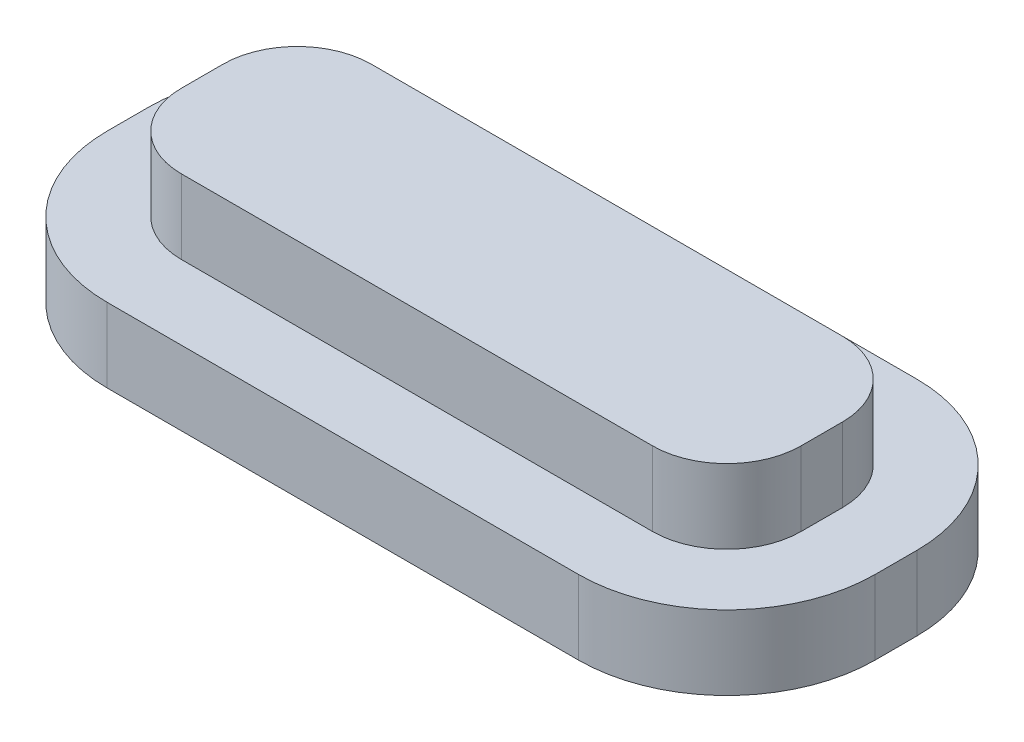
ISO-10303-21;
HEADER;
FILE_DESCRIPTION(('STEP AP214'),'2;1');
FILE_NAME('part.step','',(''),(''),'','','');
FILE_SCHEMA(('AUTOMOTIVE_DESIGN { 1 0 10303 214 1 1 1 1 }'));
ENDSEC;
DATA;
#1=APPLICATION_CONTEXT('core data for automotive mechanical design processes');
#2=APPLICATION_PROTOCOL_DEFINITION('international standard','automotive_design',2000,#1);
#3=PRODUCT_CONTEXT('',#1,'mechanical');
#4=PRODUCT('Part','Part','',(#3));
#5=PRODUCT_RELATED_PRODUCT_CATEGORY('part','',(#4));
#6=PRODUCT_DEFINITION_FORMATION('','',#4);
#7=PRODUCT_DEFINITION_CONTEXT('part definition',#1,'design');
#8=PRODUCT_DEFINITION('design','',#6,#7);
#9=PRODUCT_DEFINITION_SHAPE('','',#8);
#10=(LENGTH_UNIT() NAMED_UNIT(*) SI_UNIT(.MILLI.,.METRE.));
#11=(NAMED_UNIT(*) PLANE_ANGLE_UNIT() SI_UNIT($,.RADIAN.));
#12=(NAMED_UNIT(*) SI_UNIT($,.STERADIAN.) SOLID_ANGLE_UNIT());
#13=UNCERTAINTY_MEASURE_WITH_UNIT(LENGTH_MEASURE(1.E-05),#10,'distance_accuracy_value','');
#14=(GEOMETRIC_REPRESENTATION_CONTEXT(3) GLOBAL_UNCERTAINTY_ASSIGNED_CONTEXT((#13)) GLOBAL_UNIT_ASSIGNED_CONTEXT((#10,
#11,#12)) REPRESENTATION_CONTEXT('',''));
#15=CARTESIAN_POINT('',(0.,0.,0.));
#16=DIRECTION('',(0.,0.,1.));
#17=DIRECTION('',(1.,0.,0.));
#18=AXIS2_PLACEMENT_3D('',#15,#16,#17);
#19=CARTESIAN_POINT('',(-3.17499999999999,1.,-0.279999999999997));
#20=DIRECTION('',(0.,-1.,0.));
#21=DIRECTION('',(0.,0.,-1.));
#22=AXIS2_PLACEMENT_3D('',#19,#20,#21);
#23=PLANE('',#22);
#24=CARTESIAN_POINT('',(-3.17499999999999,1.,-0.279999999999997));
#25=DIRECTION('',(0.,1.,0.));
#26=DIRECTION('',(0.,0.,-1.));
#27=AXIS2_PLACEMENT_3D('',#24,#25,#26);
#28=CIRCLE('',#27,2.);
#29=CARTESIAN_POINT('',(-3.17499999999999,1.,-2.28));
#30=VERTEX_POINT('',#29);
#31=CARTESIAN_POINT('',(-5.17499999999999,1.,-0.279999999999997));
#32=VERTEX_POINT('',#31);
#33=EDGE_CURVE('E158',#30,#32,#28,.T.);
#34=ORIENTED_EDGE('',*,*,#33,.T.);
#35=DIRECTION('',(0.,0.,1.));
#36=VECTOR('',#35,1.);
#37=CARTESIAN_POINT('',(-5.17499999999999,1.,0.280000000000003));
#38=LINE('',#37,#36);
#39=CARTESIAN_POINT('',(-5.17499999999999,1.,0.280000000000004));
#40=VERTEX_POINT('',#39);
#41=EDGE_CURVE('E101',#32,#40,#38,.T.);
#42=ORIENTED_EDGE('',*,*,#41,.T.);
#43=CARTESIAN_POINT('',(-3.17499999999999,1.,0.280000000000003));
#44=DIRECTION('',(0.,1.,0.));
#45=DIRECTION('',(0.,0.,-1.));
#46=AXIS2_PLACEMENT_3D('',#43,#44,#45);
#47=CIRCLE('',#46,2.);
#48=CARTESIAN_POINT('',(-3.17499999999999,1.,2.28));
#49=VERTEX_POINT('',#48);
#50=EDGE_CURVE('E173',#40,#49,#47,.T.);
#51=ORIENTED_EDGE('',*,*,#50,.T.);
#52=DIRECTION('',(1.,0.,0.));
#53=VECTOR('',#52,1.);
#54=CARTESIAN_POINT('',(-3.17499999999999,1.,2.28));
#55=LINE('',#54,#53);
#56=CARTESIAN_POINT('',(3.17500000000002,1.,2.27999999999999));
#57=VERTEX_POINT('',#56);
#58=EDGE_CURVE('E185',#49,#57,#55,.T.);
#59=ORIENTED_EDGE('',*,*,#58,.T.);
#60=CARTESIAN_POINT('',(3.17500000000002,1.,0.280000000000003));
#61=DIRECTION('',(0.,1.,0.));
#62=DIRECTION('',(0.,0.,1.));
#63=AXIS2_PLACEMENT_3D('',#60,#61,#62);
#64=CIRCLE('',#63,1.99999999999999);
#65=CARTESIAN_POINT('',(5.17500000000001,1.,0.280000000000003));
#66=VERTEX_POINT('',#65);
#67=EDGE_CURVE('E122',#57,#66,#64,.T.);
#68=ORIENTED_EDGE('',*,*,#67,.T.);
#69=DIRECTION('',(0.,0.,-1.));
#70=VECTOR('',#69,1.);
#71=CARTESIAN_POINT('',(5.17500000000001,1.,0.280000000000003));
#72=LINE('',#71,#70);
#73=CARTESIAN_POINT('',(5.17500000000001,1.,-0.279999999999997));
#74=VERTEX_POINT('',#73);
#75=EDGE_CURVE('E116',#66,#74,#72,.T.);
#76=ORIENTED_EDGE('',*,*,#75,.T.);
#77=CARTESIAN_POINT('',(3.17500000000002,1.,-0.279999999999997));
#78=DIRECTION('',(0.,1.,0.));
#79=DIRECTION('',(0.,0.,-1.));
#80=AXIS2_PLACEMENT_3D('',#77,#78,#79);
#81=CIRCLE('',#80,2.);
#82=CARTESIAN_POINT('',(3.17500000000002,1.,-2.28));
#83=VERTEX_POINT('',#82);
#84=EDGE_CURVE('E119',#74,#83,#81,.T.);
#85=ORIENTED_EDGE('',*,*,#84,.T.);
#86=DIRECTION('',(-1.,0.,0.));
#87=VECTOR('',#86,1.);
#88=CARTESIAN_POINT('',(-3.17499999999999,1.,-2.28));
#89=LINE('',#88,#87);
#90=EDGE_CURVE('E60',#83,#30,#89,.T.);
#91=ORIENTED_EDGE('',*,*,#90,.T.);
#92=EDGE_LOOP('',(#34,#42,#51,#59,#68,#76,#85,#91));
#93=FACE_BOUND('',#92,.T.);
#94=CARTESIAN_POINT('',(-3.17499999999999,1.,-0.279999999999997));
#95=DIRECTION('',(0.,1.,0.));
#96=DIRECTION('',(0.,0.,-1.));
#97=AXIS2_PLACEMENT_3D('',#94,#95,#96);
#98=CIRCLE('',#97,1.);
#99=CARTESIAN_POINT('',(-3.17499999999999,1.,-1.28));
#100=VERTEX_POINT('',#99);
#101=CARTESIAN_POINT('',(-4.17499999999999,1.,-0.279999999999997));
#102=VERTEX_POINT('',#101);
#103=EDGE_CURVE('E209',#100,#102,#98,.T.);
#104=ORIENTED_EDGE('',*,*,#103,.F.);
#105=DIRECTION('',(-1.,0.,0.));
#106=VECTOR('',#105,1.);
#107=CARTESIAN_POINT('',(-3.17499999999999,1.,-1.28));
#108=LINE('',#107,#106);
#109=CARTESIAN_POINT('',(3.17500000000002,1.,-1.28));
#110=VERTEX_POINT('',#109);
#111=EDGE_CURVE('E51',#110,#100,#108,.T.);
#112=ORIENTED_EDGE('',*,*,#111,.F.);
#113=CARTESIAN_POINT('',(3.17500000000002,1.,-0.279999999999997));
#114=DIRECTION('',(0.,1.,0.));
#115=DIRECTION('',(0.,0.,-1.));
#116=AXIS2_PLACEMENT_3D('',#113,#114,#115);
#117=CIRCLE('',#116,0.999999999999994);
#118=CARTESIAN_POINT('',(4.17500000000001,1.,-0.279999999999997));
#119=VERTEX_POINT('',#118);
#120=EDGE_CURVE('E192',#119,#110,#117,.T.);
#121=ORIENTED_EDGE('',*,*,#120,.F.);
#122=DIRECTION('',(0.,0.,-1.));
#123=VECTOR('',#122,1.);
#124=CARTESIAN_POINT('',(4.17500000000001,1.,0.280000000000003));
#125=LINE('',#124,#123);
#126=CARTESIAN_POINT('',(4.17500000000001,1.,0.280000000000003));
#127=VERTEX_POINT('',#126);
#128=EDGE_CURVE('E194',#127,#119,#125,.T.);
#129=ORIENTED_EDGE('',*,*,#128,.F.);
#130=CARTESIAN_POINT('',(3.17500000000002,1.,0.280000000000003));
#131=DIRECTION('',(0.,1.,0.));
#132=DIRECTION('',(0.,0.,1.));
#133=AXIS2_PLACEMENT_3D('',#130,#131,#132);
#134=CIRCLE('',#133,0.999999999999994);
#135=CARTESIAN_POINT('',(3.17500000000002,1.,1.28));
#136=VERTEX_POINT('',#135);
#137=EDGE_CURVE('E197',#136,#127,#134,.T.);
#138=ORIENTED_EDGE('',*,*,#137,.F.);
#139=DIRECTION('',(1.,0.,0.));
#140=VECTOR('',#139,1.);
#141=CARTESIAN_POINT('',(-3.17499999999999,1.,1.28));
#142=LINE('',#141,#140);
#143=CARTESIAN_POINT('',(-3.17499999999999,1.,1.28));
#144=VERTEX_POINT('',#143);
#145=EDGE_CURVE('E200',#144,#136,#142,.T.);
#146=ORIENTED_EDGE('',*,*,#145,.F.);
#147=CARTESIAN_POINT('',(-3.17499999999999,1.,0.280000000000003));
#148=DIRECTION('',(0.,1.,0.));
#149=DIRECTION('',(0.,0.,-1.));
#150=AXIS2_PLACEMENT_3D('',#147,#148,#149);
#151=CIRCLE('',#150,1.);
#152=CARTESIAN_POINT('',(-4.17499999999999,1.,0.280000000000003));
#153=VERTEX_POINT('',#152);
#154=EDGE_CURVE('E203',#153,#144,#151,.T.);
#155=ORIENTED_EDGE('',*,*,#154,.F.);
#156=DIRECTION('',(0.,0.,1.));
#157=VECTOR('',#156,1.);
#158=CARTESIAN_POINT('',(-4.17499999999999,1.,0.280000000000003));
#159=LINE('',#158,#157);
#160=EDGE_CURVE('E206',#102,#153,#159,.T.);
#161=ORIENTED_EDGE('',*,*,#160,.F.);
#162=EDGE_LOOP('',(#104,#112,#121,#129,#138,#146,#155,#161));
#163=FACE_BOUND('',#162,.T.);
#164=ADVANCED_FACE('F36',(#93,#163),#23,.F.);
#165=CARTESIAN_POINT('',(-3.17499999999999,0.,-0.279999999999997));
#166=DIRECTION('',(0.,-1.,0.));
#167=DIRECTION('',(0.,0.,-1.));
#168=AXIS2_PLACEMENT_3D('',#165,#166,#167);
#169=PLANE('',#168);
#170=CARTESIAN_POINT('',(-3.17499999999999,0.,-0.279999999999997));
#171=DIRECTION('',(0.,1.,0.));
#172=DIRECTION('',(0.,0.,-1.));
#173=AXIS2_PLACEMENT_3D('',#170,#171,#172);
#174=CIRCLE('',#173,2.);
#175=CARTESIAN_POINT('',(-3.17499999999999,0.,-2.28));
#176=VERTEX_POINT('',#175);
#177=CARTESIAN_POINT('',(-5.17499999999999,0.,-0.279999999999997));
#178=VERTEX_POINT('',#177);
#179=EDGE_CURVE('E143',#176,#178,#174,.T.);
#180=ORIENTED_EDGE('',*,*,#179,.F.);
#181=DIRECTION('',(-1.,0.,0.));
#182=VECTOR('',#181,1.);
#183=CARTESIAN_POINT('',(-3.17499999999999,0.,-2.28));
#184=LINE('',#183,#182);
#185=CARTESIAN_POINT('',(3.17500000000002,0.,-2.28));
#186=VERTEX_POINT('',#185);
#187=EDGE_CURVE('E93',#186,#176,#184,.T.);
#188=ORIENTED_EDGE('',*,*,#187,.F.);
#189=CARTESIAN_POINT('',(3.17500000000002,0.,-0.279999999999997));
#190=DIRECTION('',(0.,1.,0.));
#191=DIRECTION('',(0.,0.,-1.));
#192=AXIS2_PLACEMENT_3D('',#189,#190,#191);
#193=CIRCLE('',#192,2.);
#194=CARTESIAN_POINT('',(5.17500000000001,0.,-0.279999999999997));
#195=VERTEX_POINT('',#194);
#196=EDGE_CURVE('E155',#195,#186,#193,.T.);
#197=ORIENTED_EDGE('',*,*,#196,.F.);
#198=DIRECTION('',(0.,0.,-1.));
#199=VECTOR('',#198,1.);
#200=CARTESIAN_POINT('',(5.17500000000001,0.,0.280000000000003));
#201=LINE('',#200,#199);
#202=CARTESIAN_POINT('',(5.17500000000001,0.,0.280000000000003));
#203=VERTEX_POINT('',#202);
#204=EDGE_CURVE('E131',#203,#195,#201,.T.);
#205=ORIENTED_EDGE('',*,*,#204,.F.);
#206=CARTESIAN_POINT('',(3.17500000000002,0.,0.280000000000003));
#207=DIRECTION('',(0.,1.,0.));
#208=DIRECTION('',(0.,0.,1.));
#209=AXIS2_PLACEMENT_3D('',#206,#207,#208);
#210=CIRCLE('',#209,1.99999999999999);
#211=CARTESIAN_POINT('',(3.17500000000002,0.,2.27999999999999));
#212=VERTEX_POINT('',#211);
#213=EDGE_CURVE('E152',#212,#203,#210,.T.);
#214=ORIENTED_EDGE('',*,*,#213,.F.);
#215=DIRECTION('',(1.,0.,0.));
#216=VECTOR('',#215,1.);
#217=CARTESIAN_POINT('',(-3.17499999999999,0.,2.28));
#218=LINE('',#217,#216);
#219=CARTESIAN_POINT('',(-3.17499999999999,0.,2.28));
#220=VERTEX_POINT('',#219);
#221=EDGE_CURVE('E150',#220,#212,#218,.T.);
#222=ORIENTED_EDGE('',*,*,#221,.F.);
#223=CARTESIAN_POINT('',(-3.17499999999999,0.,0.280000000000003));
#224=DIRECTION('',(0.,1.,0.));
#225=DIRECTION('',(0.,0.,-1.));
#226=AXIS2_PLACEMENT_3D('',#223,#224,#225);
#227=CIRCLE('',#226,2.);
#228=CARTESIAN_POINT('',(-5.17499999999999,0.,0.280000000000004));
#229=VERTEX_POINT('',#228);
#230=EDGE_CURVE('E148',#229,#220,#227,.T.);
#231=ORIENTED_EDGE('',*,*,#230,.F.);
#232=DIRECTION('',(0.,0.,1.));
#233=VECTOR('',#232,1.);
#234=CARTESIAN_POINT('',(-5.17499999999999,0.,0.280000000000003));
#235=LINE('',#234,#233);
#236=EDGE_CURVE('E146',#178,#229,#235,.T.);
#237=ORIENTED_EDGE('',*,*,#236,.F.);
#238=EDGE_LOOP('',(#180,#188,#197,#205,#214,#222,#231,#237));
#239=FACE_BOUND('',#238,.T.);
#240=ADVANCED_FACE('F177',(#239),#169,.T.);
#241=CARTESIAN_POINT('',(-3.17499999999999,1.,-0.279999999999997));
#242=DIRECTION('',(0.,-1.,0.));
#243=DIRECTION('',(0.,0.,-1.));
#244=AXIS2_PLACEMENT_3D('',#241,#242,#243);
#245=CYLINDRICAL_SURFACE('',#244,2.);
#246=ORIENTED_EDGE('',*,*,#179,.T.);
#247=DIRECTION('',(0.,-1.,0.));
#248=VECTOR('',#247,1.);
#249=CARTESIAN_POINT('',(-5.17499999999999,1.,-0.279999999999997));
#250=LINE('',#249,#248);
#251=EDGE_CURVE('E11',#32,#178,#250,.T.);
#252=ORIENTED_EDGE('',*,*,#251,.F.);
#253=ORIENTED_EDGE('',*,*,#33,.F.);
#254=DIRECTION('',(0.,-1.,0.));
#255=VECTOR('',#254,1.);
#256=CARTESIAN_POINT('',(-3.17499999999999,1.,-2.28));
#257=LINE('',#256,#255);
#258=EDGE_CURVE('E139',#30,#176,#257,.T.);
#259=ORIENTED_EDGE('',*,*,#258,.T.);
#260=EDGE_LOOP('',(#246,#252,#253,#259));
#261=FACE_BOUND('',#260,.T.);
#262=ADVANCED_FACE('F38',(#261),#245,.T.);
#263=CARTESIAN_POINT('',(-5.17499999999999,1.,0.280000000000003));
#264=DIRECTION('',(1.,0.,0.));
#265=DIRECTION('',(0.,0.,-1.));
#266=AXIS2_PLACEMENT_3D('',#263,#264,#265);
#267=PLANE('',#266);
#268=ORIENTED_EDGE('',*,*,#236,.T.);
#269=DIRECTION('',(0.,-1.,0.));
#270=VECTOR('',#269,1.);
#271=CARTESIAN_POINT('',(-5.17499999999999,1.,0.280000000000004));
#272=LINE('',#271,#270);
#273=EDGE_CURVE('E44',#40,#229,#272,.T.);
#274=ORIENTED_EDGE('',*,*,#273,.F.);
#275=ORIENTED_EDGE('',*,*,#41,.F.);
#276=ORIENTED_EDGE('',*,*,#251,.T.);
#277=EDGE_LOOP('',(#268,#274,#275,#276));
#278=FACE_BOUND('',#277,.T.);
#279=ADVANCED_FACE('F354',(#278),#267,.F.);
#280=CARTESIAN_POINT('',(-3.17499999999999,1.,0.280000000000003));
#281=DIRECTION('',(0.,-1.,0.));
#282=DIRECTION('',(0.,0.,-1.));
#283=AXIS2_PLACEMENT_3D('',#280,#281,#282);
#284=CYLINDRICAL_SURFACE('',#283,2.);
#285=ORIENTED_EDGE('',*,*,#230,.T.);
#286=DIRECTION('',(0.,-1.,0.));
#287=VECTOR('',#286,1.);
#288=CARTESIAN_POINT('',(-3.17499999999999,1.,2.28));
#289=LINE('',#288,#287);
#290=EDGE_CURVE('E165',#49,#220,#289,.T.);
#291=ORIENTED_EDGE('',*,*,#290,.F.);
#292=ORIENTED_EDGE('',*,*,#50,.F.);
#293=ORIENTED_EDGE('',*,*,#273,.T.);
#294=EDGE_LOOP('',(#285,#291,#292,#293));
#295=FACE_BOUND('',#294,.T.);
#296=ADVANCED_FACE('F171',(#295),#284,.T.);
#297=CARTESIAN_POINT('',(-3.17499999999999,1.,2.28));
#298=DIRECTION('',(0.,0.,-1.));
#299=DIRECTION('',(-1.,0.,0.));
#300=AXIS2_PLACEMENT_3D('',#297,#298,#299);
#301=PLANE('',#300);
#302=ORIENTED_EDGE('',*,*,#221,.T.);
#303=DIRECTION('',(0.,-1.,0.));
#304=VECTOR('',#303,1.);
#305=CARTESIAN_POINT('',(3.17500000000002,1.,2.27999999999999));
#306=LINE('',#305,#304);
#307=EDGE_CURVE('E162',#57,#212,#306,.T.);
#308=ORIENTED_EDGE('',*,*,#307,.F.);
#309=ORIENTED_EDGE('',*,*,#58,.F.);
#310=ORIENTED_EDGE('',*,*,#290,.T.);
#311=EDGE_LOOP('',(#302,#308,#309,#310));
#312=FACE_BOUND('',#311,.T.);
#313=ADVANCED_FACE('F181',(#312),#301,.F.);
#314=CARTESIAN_POINT('',(3.17500000000002,1.,0.280000000000003));
#315=DIRECTION('',(0.,-1.,0.));
#316=DIRECTION('',(0.,0.,-1.));
#317=AXIS2_PLACEMENT_3D('',#314,#315,#316);
#318=CYLINDRICAL_SURFACE('',#317,1.99999999999999);
#319=ORIENTED_EDGE('',*,*,#213,.T.);
#320=DIRECTION('',(0.,-1.,0.));
#321=VECTOR('',#320,1.);
#322=CARTESIAN_POINT('',(5.17500000000001,1.,0.280000000000003));
#323=LINE('',#322,#321);
#324=EDGE_CURVE('E134',#66,#203,#323,.T.);
#325=ORIENTED_EDGE('',*,*,#324,.F.);
#326=ORIENTED_EDGE('',*,*,#67,.F.);
#327=ORIENTED_EDGE('',*,*,#307,.T.);
#328=EDGE_LOOP('',(#319,#325,#326,#327));
#329=FACE_BOUND('',#328,.T.);
#330=ADVANCED_FACE('F184',(#329),#318,.T.);
#331=CARTESIAN_POINT('',(5.17500000000001,1.,0.280000000000003));
#332=DIRECTION('',(-1.,0.,0.));
#333=DIRECTION('',(0.,0.,1.));
#334=AXIS2_PLACEMENT_3D('',#331,#332,#333);
#335=PLANE('',#334);
#336=ORIENTED_EDGE('',*,*,#204,.T.);
#337=DIRECTION('',(0.,-1.,0.));
#338=VECTOR('',#337,1.);
#339=CARTESIAN_POINT('',(5.17500000000001,1.,-0.279999999999997));
#340=LINE('',#339,#338);
#341=EDGE_CURVE('E128',#74,#195,#340,.T.);
#342=ORIENTED_EDGE('',*,*,#341,.F.);
#343=ORIENTED_EDGE('',*,*,#75,.F.);
#344=ORIENTED_EDGE('',*,*,#324,.T.);
#345=EDGE_LOOP('',(#336,#342,#343,#344));
#346=FACE_BOUND('',#345,.T.);
#347=ADVANCED_FACE('F129',(#346),#335,.F.);
#348=CARTESIAN_POINT('',(3.17500000000002,1.,-0.279999999999997));
#349=DIRECTION('',(0.,-1.,0.));
#350=DIRECTION('',(0.,0.,-1.));
#351=AXIS2_PLACEMENT_3D('',#348,#349,#350);
#352=CYLINDRICAL_SURFACE('',#351,2.);
#353=ORIENTED_EDGE('',*,*,#196,.T.);
#354=DIRECTION('',(0.,-1.,0.));
#355=VECTOR('',#354,1.);
#356=CARTESIAN_POINT('',(3.17500000000002,1.,-2.28));
#357=LINE('',#356,#355);
#358=EDGE_CURVE('E135',#83,#186,#357,.T.);
#359=ORIENTED_EDGE('',*,*,#358,.F.);
#360=ORIENTED_EDGE('',*,*,#84,.F.);
#361=ORIENTED_EDGE('',*,*,#341,.T.);
#362=EDGE_LOOP('',(#353,#359,#360,#361));
#363=FACE_BOUND('',#362,.T.);
#364=ADVANCED_FACE('F137',(#363),#352,.T.);
#365=CARTESIAN_POINT('',(-3.17499999999999,1.,-2.28));
#366=DIRECTION('',(0.,0.,1.));
#367=DIRECTION('',(1.,0.,0.));
#368=AXIS2_PLACEMENT_3D('',#365,#366,#367);
#369=PLANE('',#368);
#370=ORIENTED_EDGE('',*,*,#187,.T.);
#371=ORIENTED_EDGE('',*,*,#258,.F.);
#372=ORIENTED_EDGE('',*,*,#90,.F.);
#373=ORIENTED_EDGE('',*,*,#358,.T.);
#374=EDGE_LOOP('',(#370,#371,#372,#373));
#375=FACE_BOUND('',#374,.T.);
#376=ADVANCED_FACE('F342',(#375),#369,.F.);
#377=CARTESIAN_POINT('',(-4.17499999999999,2.,0.));
#378=DIRECTION('',(-1.,0.,0.));
#379=DIRECTION('',(0.,0.,1.));
#380=AXIS2_PLACEMENT_3D('',#377,#378,#379);
#381=PLANE('',#380);
#382=ORIENTED_EDGE('',*,*,#160,.T.);
#383=DIRECTION('',(0.,-1.,0.));
#384=VECTOR('',#383,1.);
#385=CARTESIAN_POINT('',(-4.17499999999999,2.,0.280000000000003));
#386=LINE('',#385,#384);
#387=CARTESIAN_POINT('',(-4.17499999999999,2.,0.280000000000003));
#388=VERTEX_POINT('',#387);
#389=EDGE_CURVE('E221',#388,#153,#386,.T.);
#390=ORIENTED_EDGE('',*,*,#389,.F.);
#391=DIRECTION('',(0.,0.,-1.));
#392=VECTOR('',#391,1.);
#393=CARTESIAN_POINT('',(-4.17499999999999,2.,0.));
#394=LINE('',#393,#392);
#395=CARTESIAN_POINT('',(-4.17499999999999,2.,-0.279999999999997));
#396=VERTEX_POINT('',#395);
#397=EDGE_CURVE('E248',#388,#396,#394,.T.);
#398=ORIENTED_EDGE('',*,*,#397,.T.);
#399=DIRECTION('',(0.,-1.,0.));
#400=VECTOR('',#399,1.);
#401=CARTESIAN_POINT('',(-4.17499999999999,2.,-0.279999999999997));
#402=LINE('',#401,#400);
#403=EDGE_CURVE('E218',#396,#102,#402,.T.);
#404=ORIENTED_EDGE('',*,*,#403,.T.);
#405=EDGE_LOOP('',(#382,#390,#398,#404));
#406=FACE_BOUND('',#405,.T.);
#407=ADVANCED_FACE('F312',(#406),#381,.T.);
#408=CARTESIAN_POINT('',(-3.17499999999999,2.,0.280000000000003));
#409=DIRECTION('',(0.,-1.,0.));
#410=DIRECTION('',(0.,0.,-1.));
#411=AXIS2_PLACEMENT_3D('',#408,#409,#410);
#412=CYLINDRICAL_SURFACE('',#411,1.);
#413=ORIENTED_EDGE('',*,*,#154,.T.);
#414=DIRECTION('',(0.,-1.,0.));
#415=VECTOR('',#414,1.);
#416=CARTESIAN_POINT('',(-3.17499999999999,2.,1.28));
#417=LINE('',#416,#415);
#418=CARTESIAN_POINT('',(-3.17499999999999,2.,1.28));
#419=VERTEX_POINT('',#418);
#420=EDGE_CURVE('E224',#419,#144,#417,.T.);
#421=ORIENTED_EDGE('',*,*,#420,.F.);
#422=CARTESIAN_POINT('',(-3.17499999999999,2.,0.280000000000003));
#423=DIRECTION('',(0.,1.,0.));
#424=DIRECTION('',(0.,0.,1.));
#425=AXIS2_PLACEMENT_3D('',#422,#423,#424);
#426=CIRCLE('',#425,1.);
#427=EDGE_CURVE('E245',#419,#388,#426,.F.);
#428=ORIENTED_EDGE('',*,*,#427,.T.);
#429=ORIENTED_EDGE('',*,*,#389,.T.);
#430=EDGE_LOOP('',(#413,#421,#428,#429));
#431=FACE_BOUND('',#430,.T.);
#432=ADVANCED_FACE('F314',(#431),#412,.T.);
#433=CARTESIAN_POINT('',(0.,2.,1.28));
#434=DIRECTION('',(0.,0.,-1.));
#435=DIRECTION('',(-1.,0.,0.));
#436=AXIS2_PLACEMENT_3D('',#433,#434,#435);
#437=PLANE('',#436);
#438=ORIENTED_EDGE('',*,*,#420,.T.);
#439=ORIENTED_EDGE('',*,*,#145,.T.);
#440=DIRECTION('',(0.,-1.,0.));
#441=VECTOR('',#440,1.);
#442=CARTESIAN_POINT('',(3.17500000000002,2.,1.28));
#443=LINE('',#442,#441);
#444=CARTESIAN_POINT('',(3.17500000000002,2.,1.28));
#445=VERTEX_POINT('',#444);
#446=EDGE_CURVE('E227',#445,#136,#443,.T.);
#447=ORIENTED_EDGE('',*,*,#446,.F.);
#448=DIRECTION('',(1.,0.,0.));
#449=VECTOR('',#448,1.);
#450=CARTESIAN_POINT('',(0.,2.,1.28));
#451=LINE('',#450,#449);
#452=EDGE_CURVE('E242',#419,#445,#451,.T.);
#453=ORIENTED_EDGE('',*,*,#452,.F.);
#454=EDGE_LOOP('',(#438,#439,#447,#453));
#455=FACE_BOUND('',#454,.T.);
#456=ADVANCED_FACE('F320',(#455),#437,.F.);
#457=CARTESIAN_POINT('',(3.17500000000002,2.,0.280000000000003));
#458=DIRECTION('',(0.,-1.,0.));
#459=DIRECTION('',(0.,0.,-1.));
#460=AXIS2_PLACEMENT_3D('',#457,#458,#459);
#461=CYLINDRICAL_SURFACE('',#460,0.999999999999994);
#462=ORIENTED_EDGE('',*,*,#446,.T.);
#463=ORIENTED_EDGE('',*,*,#137,.T.);
#464=DIRECTION('',(0.,-1.,0.));
#465=VECTOR('',#464,1.);
#466=CARTESIAN_POINT('',(4.17500000000001,2.,0.280000000000003));
#467=LINE('',#466,#465);
#468=CARTESIAN_POINT('',(4.17500000000001,2.,0.280000000000003));
#469=VERTEX_POINT('',#468);
#470=EDGE_CURVE('E230',#469,#127,#467,.T.);
#471=ORIENTED_EDGE('',*,*,#470,.F.);
#472=CARTESIAN_POINT('',(3.17500000000002,2.,0.280000000000003));
#473=DIRECTION('',(0.,1.,0.));
#474=DIRECTION('',(0.,0.,1.));
#475=AXIS2_PLACEMENT_3D('',#472,#473,#474);
#476=CIRCLE('',#475,0.999999999999994);
#477=EDGE_CURVE('E239',#445,#469,#476,.T.);
#478=ORIENTED_EDGE('',*,*,#477,.F.);
#479=EDGE_LOOP('',(#462,#463,#471,#478));
#480=FACE_BOUND('',#479,.T.);
#481=ADVANCED_FACE('F322',(#480),#461,.T.);
#482=CARTESIAN_POINT('',(0.,2.,-1.28));
#483=DIRECTION('',(0.,0.,-1.));
#484=DIRECTION('',(-1.,0.,0.));
#485=AXIS2_PLACEMENT_3D('',#482,#483,#484);
#486=PLANE('',#485);
#487=ORIENTED_EDGE('',*,*,#111,.T.);
#488=DIRECTION('',(0.,-1.,0.));
#489=VECTOR('',#488,1.);
#490=CARTESIAN_POINT('',(-3.17499999999999,2.,-1.28));
#491=LINE('',#490,#489);
#492=CARTESIAN_POINT('',(-3.17499999999999,2.,-1.28));
#493=VERTEX_POINT('',#492);
#494=EDGE_CURVE('E215',#493,#100,#491,.T.);
#495=ORIENTED_EDGE('',*,*,#494,.F.);
#496=DIRECTION('',(1.,0.,0.));
#497=VECTOR('',#496,1.);
#498=CARTESIAN_POINT('',(0.,2.,-1.28));
#499=LINE('',#498,#497);
#500=CARTESIAN_POINT('',(3.17500000000002,2.,-1.28));
#501=VERTEX_POINT('',#500);
#502=EDGE_CURVE('E254',#493,#501,#499,.T.);
#503=ORIENTED_EDGE('',*,*,#502,.T.);
#504=DIRECTION('',(0.,-1.,0.));
#505=VECTOR('',#504,1.);
#506=CARTESIAN_POINT('',(3.17500000000002,2.,-1.28));
#507=LINE('',#506,#505);
#508=EDGE_CURVE('E212',#501,#110,#507,.T.);
#509=ORIENTED_EDGE('',*,*,#508,.T.);
#510=EDGE_LOOP('',(#487,#495,#503,#509));
#511=FACE_BOUND('',#510,.T.);
#512=ADVANCED_FACE('F278',(#511),#486,.T.);
#513=CARTESIAN_POINT('',(4.17500000000001,2.,0.));
#514=DIRECTION('',(-1.,0.,0.));
#515=DIRECTION('',(0.,0.,1.));
#516=AXIS2_PLACEMENT_3D('',#513,#514,#515);
#517=PLANE('',#516);
#518=ORIENTED_EDGE('',*,*,#470,.T.);
#519=ORIENTED_EDGE('',*,*,#128,.T.);
#520=DIRECTION('',(0.,-1.,0.));
#521=VECTOR('',#520,1.);
#522=CARTESIAN_POINT('',(4.17500000000001,2.,-0.279999999999997));
#523=LINE('',#522,#521);
#524=CARTESIAN_POINT('',(4.17500000000001,2.,-0.279999999999997));
#525=VERTEX_POINT('',#524);
#526=EDGE_CURVE('E233',#525,#119,#523,.T.);
#527=ORIENTED_EDGE('',*,*,#526,.F.);
#528=DIRECTION('',(0.,0.,-1.));
#529=VECTOR('',#528,1.);
#530=CARTESIAN_POINT('',(4.17500000000001,2.,0.));
#531=LINE('',#530,#529);
#532=EDGE_CURVE('E236',#469,#525,#531,.T.);
#533=ORIENTED_EDGE('',*,*,#532,.F.);
#534=EDGE_LOOP('',(#518,#519,#527,#533));
#535=FACE_BOUND('',#534,.T.);
#536=ADVANCED_FACE('F324',(#535),#517,.F.);
#537=CARTESIAN_POINT('',(3.17500000000002,2.,-0.279999999999997));
#538=DIRECTION('',(0.,-1.,0.));
#539=DIRECTION('',(0.,0.,-1.));
#540=AXIS2_PLACEMENT_3D('',#537,#538,#539);
#541=CYLINDRICAL_SURFACE('',#540,0.999999999999994);
#542=ORIENTED_EDGE('',*,*,#120,.T.);
#543=ORIENTED_EDGE('',*,*,#508,.F.);
#544=CARTESIAN_POINT('',(3.17500000000002,2.,-0.279999999999997));
#545=DIRECTION('',(0.,1.,0.));
#546=DIRECTION('',(0.,0.,1.));
#547=AXIS2_PLACEMENT_3D('',#544,#545,#546);
#548=CIRCLE('',#547,0.999999999999994);
#549=EDGE_CURVE('E257',#501,#525,#548,.F.);
#550=ORIENTED_EDGE('',*,*,#549,.T.);
#551=ORIENTED_EDGE('',*,*,#526,.T.);
#552=EDGE_LOOP('',(#542,#543,#550,#551));
#553=FACE_BOUND('',#552,.T.);
#554=ADVANCED_FACE('F263',(#553),#541,.T.);
#555=CARTESIAN_POINT('',(-3.17499999999999,2.,-0.279999999999997));
#556=DIRECTION('',(0.,-1.,0.));
#557=DIRECTION('',(0.,0.,-1.));
#558=AXIS2_PLACEMENT_3D('',#555,#556,#557);
#559=CYLINDRICAL_SURFACE('',#558,1.);
#560=ORIENTED_EDGE('',*,*,#103,.T.);
#561=ORIENTED_EDGE('',*,*,#403,.F.);
#562=CARTESIAN_POINT('',(-3.17499999999999,2.,-0.279999999999997));
#563=DIRECTION('',(0.,1.,0.));
#564=DIRECTION('',(0.,0.,1.));
#565=AXIS2_PLACEMENT_3D('',#562,#563,#564);
#566=CIRCLE('',#565,1.);
#567=EDGE_CURVE('E251',#396,#493,#566,.F.);
#568=ORIENTED_EDGE('',*,*,#567,.T.);
#569=ORIENTED_EDGE('',*,*,#494,.T.);
#570=EDGE_LOOP('',(#560,#561,#568,#569));
#571=FACE_BOUND('',#570,.T.);
#572=ADVANCED_FACE('F282',(#571),#559,.T.);
#573=CARTESIAN_POINT('',(0.,2.,0.));
#574=DIRECTION('',(0.,1.,0.));
#575=DIRECTION('',(0.,0.,1.));
#576=AXIS2_PLACEMENT_3D('',#573,#574,#575);
#577=PLANE('',#576);
#578=ORIENTED_EDGE('',*,*,#549,.F.);
#579=ORIENTED_EDGE('',*,*,#502,.F.);
#580=ORIENTED_EDGE('',*,*,#567,.F.);
#581=ORIENTED_EDGE('',*,*,#397,.F.);
#582=ORIENTED_EDGE('',*,*,#427,.F.);
#583=ORIENTED_EDGE('',*,*,#452,.T.);
#584=ORIENTED_EDGE('',*,*,#477,.T.);
#585=ORIENTED_EDGE('',*,*,#532,.T.);
#586=EDGE_LOOP('',(#578,#579,#580,#581,#582,#583,#584,#585));
#587=FACE_BOUND('',#586,.T.);
#588=ADVANCED_FACE('F271',(#587),#577,.T.);
#589=CLOSED_SHELL('',(#164,#240,#262,#279,#296,#313,#330,#347,#364,#376,#407,#432,#456,#481,
#512,#536,#554,#572,#588));
#590=MANIFOLD_SOLID_BREP('B2',#589);
#591=ADVANCED_BREP_SHAPE_REPRESENTATION('',(#18,#590),#14);
#592=SHAPE_DEFINITION_REPRESENTATION(#9,#591);
ENDSEC;
END-ISO-10303-21;
